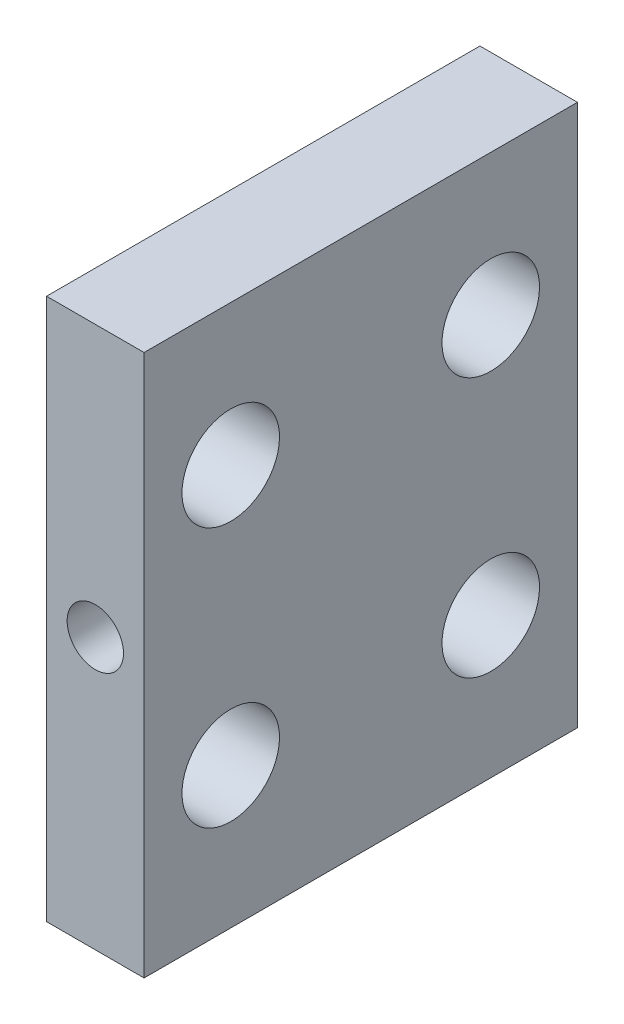
ISO-10303-21;
HEADER;
FILE_DESCRIPTION(('STEP AP214'),'2;1');
FILE_NAME('part.step','',(''),(''),'','','');
FILE_SCHEMA(('AUTOMOTIVE_DESIGN { 1 0 10303 214 1 1 1 1 }'));
ENDSEC;
DATA;
#1=APPLICATION_CONTEXT('core data for automotive mechanical design processes');
#2=APPLICATION_PROTOCOL_DEFINITION('international standard','automotive_design',2000,#1);
#3=PRODUCT_CONTEXT('',#1,'mechanical');
#4=PRODUCT('Part','Part','',(#3));
#5=PRODUCT_RELATED_PRODUCT_CATEGORY('part','',(#4));
#6=PRODUCT_DEFINITION_FORMATION('','',#4);
#7=PRODUCT_DEFINITION_CONTEXT('part definition',#1,'design');
#8=PRODUCT_DEFINITION('design','',#6,#7);
#9=PRODUCT_DEFINITION_SHAPE('','',#8);
#10=(LENGTH_UNIT() NAMED_UNIT(*) SI_UNIT(.MILLI.,.METRE.));
#11=(NAMED_UNIT(*) PLANE_ANGLE_UNIT() SI_UNIT($,.RADIAN.));
#12=(NAMED_UNIT(*) SI_UNIT($,.STERADIAN.) SOLID_ANGLE_UNIT());
#13=UNCERTAINTY_MEASURE_WITH_UNIT(LENGTH_MEASURE(1.E-05),#10,'distance_accuracy_value','');
#14=(GEOMETRIC_REPRESENTATION_CONTEXT(3) GLOBAL_UNCERTAINTY_ASSIGNED_CONTEXT((#13)) GLOBAL_UNIT_ASSIGNED_CONTEXT((#10,
#11,#12)) REPRESENTATION_CONTEXT('',''));
#15=CARTESIAN_POINT('',(0.,0.,0.));
#16=DIRECTION('',(0.,0.,1.));
#17=DIRECTION('',(1.,0.,0.));
#18=AXIS2_PLACEMENT_3D('',#15,#16,#17);
#19=CARTESIAN_POINT('',(0.,0.,20.));
#20=DIRECTION('',(1.,0.,0.));
#21=DIRECTION('',(0.,0.,-1.));
#22=AXIS2_PLACEMENT_3D('',#19,#20,#21);
#23=PLANE('',#22);
#24=DIRECTION('',(0.,-1.,0.));
#25=VECTOR('',#24,1.);
#26=CARTESIAN_POINT('',(0.,25.,0.));
#27=LINE('',#26,#25);
#28=CARTESIAN_POINT('',(0.,25.,0.));
#29=VERTEX_POINT('',#28);
#30=CARTESIAN_POINT('',(0.,0.,0.));
#31=VERTEX_POINT('',#30);
#32=EDGE_CURVE('E9',#29,#31,#27,.T.);
#33=ORIENTED_EDGE('',*,*,#32,.T.);
#34=DIRECTION('',(0.,0.,-1.));
#35=VECTOR('',#34,1.);
#36=CARTESIAN_POINT('',(0.,0.,20.));
#37=LINE('',#36,#35);
#38=CARTESIAN_POINT('',(0.,0.,20.));
#39=VERTEX_POINT('',#38);
#40=EDGE_CURVE('E34',#39,#31,#37,.T.);
#41=ORIENTED_EDGE('',*,*,#40,.F.);
#42=DIRECTION('',(0.,-1.,0.));
#43=VECTOR('',#42,1.);
#44=CARTESIAN_POINT('',(0.,25.,20.));
#45=LINE('',#44,#43);
#46=CARTESIAN_POINT('',(0.,25.,20.));
#47=VERTEX_POINT('',#46);
#48=EDGE_CURVE('E74',#47,#39,#45,.T.);
#49=ORIENTED_EDGE('',*,*,#48,.F.);
#50=DIRECTION('',(0.,0.,-1.));
#51=VECTOR('',#50,1.);
#52=CARTESIAN_POINT('',(0.,25.,20.));
#53=LINE('',#52,#51);
#54=EDGE_CURVE('E25',#47,#29,#53,.T.);
#55=ORIENTED_EDGE('',*,*,#54,.T.);
#56=EDGE_LOOP('',(#33,#41,#49,#55));
#57=FACE_BOUND('',#56,.T.);
#58=CARTESIAN_POINT('',(0.,18.5,4.));
#59=DIRECTION('',(1.,0.,0.));
#60=DIRECTION('',(0.,1.,0.));
#61=AXIS2_PLACEMENT_3D('',#58,#59,#60);
#62=CIRCLE('',#61,2.25);
#63=CARTESIAN_POINT('',(0.,20.75,4.));
#64=VERTEX_POINT('',#63);
#65=EDGE_CURVE('E136',#64,#64,#62,.T.);
#66=ORIENTED_EDGE('',*,*,#65,.T.);
#67=EDGE_LOOP('',(#66));
#68=FACE_BOUND('',#67,.T.);
#69=CARTESIAN_POINT('',(0.,6.5,4.));
#70=DIRECTION('',(1.,0.,0.));
#71=DIRECTION('',(0.,1.,0.));
#72=AXIS2_PLACEMENT_3D('',#69,#70,#71);
#73=CIRCLE('',#72,2.25);
#74=CARTESIAN_POINT('',(0.,8.75,4.));
#75=VERTEX_POINT('',#74);
#76=EDGE_CURVE('E124',#75,#75,#73,.T.);
#77=ORIENTED_EDGE('',*,*,#76,.T.);
#78=EDGE_LOOP('',(#77));
#79=FACE_BOUND('',#78,.T.);
#80=CARTESIAN_POINT('',(0.,6.5,16.));
#81=DIRECTION('',(1.,0.,0.));
#82=DIRECTION('',(0.,1.,0.));
#83=AXIS2_PLACEMENT_3D('',#80,#81,#82);
#84=CIRCLE('',#83,2.25);
#85=CARTESIAN_POINT('',(0.,8.75,16.));
#86=VERTEX_POINT('',#85);
#87=EDGE_CURVE('E120',#86,#86,#84,.T.);
#88=ORIENTED_EDGE('',*,*,#87,.T.);
#89=EDGE_LOOP('',(#88));
#90=FACE_BOUND('',#89,.T.);
#91=CARTESIAN_POINT('',(0.,18.5,16.));
#92=DIRECTION('',(1.,0.,0.));
#93=DIRECTION('',(0.,1.,0.));
#94=AXIS2_PLACEMENT_3D('',#91,#92,#93);
#95=CIRCLE('',#94,2.25);
#96=CARTESIAN_POINT('',(0.,20.75,16.));
#97=VERTEX_POINT('',#96);
#98=EDGE_CURVE('E118',#97,#97,#95,.T.);
#99=ORIENTED_EDGE('',*,*,#98,.T.);
#100=EDGE_LOOP('',(#99));
#101=FACE_BOUND('',#100,.T.);
#102=ADVANCED_FACE('F15',(#57,#68,#79,#90,#101),#23,.F.);
#103=CARTESIAN_POINT('',(0.,0.,20.));
#104=DIRECTION('',(0.,1.,0.));
#105=DIRECTION('',(0.,0.,1.));
#106=AXIS2_PLACEMENT_3D('',#103,#104,#105);
#107=PLANE('',#106);
#108=DIRECTION('',(1.,0.,0.));
#109=VECTOR('',#108,1.);
#110=CARTESIAN_POINT('',(0.,0.,0.));
#111=LINE('',#110,#109);
#112=CARTESIAN_POINT('',(4.5,0.,0.));
#113=VERTEX_POINT('',#112);
#114=EDGE_CURVE('E121',#31,#113,#111,.T.);
#115=ORIENTED_EDGE('',*,*,#114,.T.);
#116=DIRECTION('',(0.,0.,-1.));
#117=VECTOR('',#116,1.);
#118=CARTESIAN_POINT('',(4.5,0.,20.));
#119=LINE('',#118,#117);
#120=CARTESIAN_POINT('',(4.5,0.,20.));
#121=VERTEX_POINT('',#120);
#122=EDGE_CURVE('E129',#121,#113,#119,.T.);
#123=ORIENTED_EDGE('',*,*,#122,.F.);
#124=DIRECTION('',(1.,0.,0.));
#125=VECTOR('',#124,1.);
#126=CARTESIAN_POINT('',(0.,0.,20.));
#127=LINE('',#126,#125);
#128=EDGE_CURVE('E64',#39,#121,#127,.T.);
#129=ORIENTED_EDGE('',*,*,#128,.F.);
#130=ORIENTED_EDGE('',*,*,#40,.T.);
#131=EDGE_LOOP('',(#115,#123,#129,#130));
#132=FACE_BOUND('',#131,.T.);
#133=ADVANCED_FACE('F109',(#132),#107,.F.);
#134=CARTESIAN_POINT('',(4.5,0.,20.));
#135=DIRECTION('',(-1.,0.,0.));
#136=DIRECTION('',(0.,0.,1.));
#137=AXIS2_PLACEMENT_3D('',#134,#135,#136);
#138=PLANE('',#137);
#139=DIRECTION('',(0.,1.,0.));
#140=VECTOR('',#139,1.);
#141=CARTESIAN_POINT('',(4.5,0.,0.));
#142=LINE('',#141,#140);
#143=CARTESIAN_POINT('',(4.5,25.,0.));
#144=VERTEX_POINT('',#143);
#145=EDGE_CURVE('E71',#113,#144,#142,.T.);
#146=ORIENTED_EDGE('',*,*,#145,.T.);
#147=DIRECTION('',(0.,0.,-1.));
#148=VECTOR('',#147,1.);
#149=CARTESIAN_POINT('',(4.5,25.,20.));
#150=LINE('',#149,#148);
#151=CARTESIAN_POINT('',(4.5,25.,20.));
#152=VERTEX_POINT('',#151);
#153=EDGE_CURVE('E54',#152,#144,#150,.T.);
#154=ORIENTED_EDGE('',*,*,#153,.F.);
#155=DIRECTION('',(0.,1.,0.));
#156=VECTOR('',#155,1.);
#157=CARTESIAN_POINT('',(4.5,0.,20.));
#158=LINE('',#157,#156);
#159=EDGE_CURVE('E60',#121,#152,#158,.T.);
#160=ORIENTED_EDGE('',*,*,#159,.F.);
#161=ORIENTED_EDGE('',*,*,#122,.T.);
#162=EDGE_LOOP('',(#146,#154,#160,#161));
#163=FACE_BOUND('',#162,.T.);
#164=CARTESIAN_POINT('',(4.5,18.5,4.));
#165=DIRECTION('',(1.,0.,0.));
#166=DIRECTION('',(0.,1.,0.));
#167=AXIS2_PLACEMENT_3D('',#164,#165,#166);
#168=CIRCLE('',#167,2.25);
#169=CARTESIAN_POINT('',(4.5,20.75,4.));
#170=VERTEX_POINT('',#169);
#171=EDGE_CURVE('E90',#170,#170,#168,.T.);
#172=ORIENTED_EDGE('',*,*,#171,.F.);
#173=EDGE_LOOP('',(#172));
#174=FACE_BOUND('',#173,.T.);
#175=CARTESIAN_POINT('',(4.5,6.5,4.));
#176=DIRECTION('',(1.,0.,0.));
#177=DIRECTION('',(0.,1.,0.));
#178=AXIS2_PLACEMENT_3D('',#175,#176,#177);
#179=CIRCLE('',#178,2.25);
#180=CARTESIAN_POINT('',(4.5,8.75,4.));
#181=VERTEX_POINT('',#180);
#182=EDGE_CURVE('E94',#181,#181,#179,.T.);
#183=ORIENTED_EDGE('',*,*,#182,.F.);
#184=EDGE_LOOP('',(#183));
#185=FACE_BOUND('',#184,.T.);
#186=CARTESIAN_POINT('',(4.5,6.5,16.));
#187=DIRECTION('',(1.,0.,0.));
#188=DIRECTION('',(0.,1.,0.));
#189=AXIS2_PLACEMENT_3D('',#186,#187,#188);
#190=CIRCLE('',#189,2.25);
#191=CARTESIAN_POINT('',(4.5,8.75,16.));
#192=VERTEX_POINT('',#191);
#193=EDGE_CURVE('E82',#192,#192,#190,.T.);
#194=ORIENTED_EDGE('',*,*,#193,.F.);
#195=EDGE_LOOP('',(#194));
#196=FACE_BOUND('',#195,.T.);
#197=CARTESIAN_POINT('',(4.5,18.5,16.));
#198=DIRECTION('',(1.,0.,0.));
#199=DIRECTION('',(0.,1.,0.));
#200=AXIS2_PLACEMENT_3D('',#197,#198,#199);
#201=CIRCLE('',#200,2.25);
#202=CARTESIAN_POINT('',(4.5,20.75,16.));
#203=VERTEX_POINT('',#202);
#204=EDGE_CURVE('E79',#203,#203,#201,.T.);
#205=ORIENTED_EDGE('',*,*,#204,.F.);
#206=EDGE_LOOP('',(#205));
#207=FACE_BOUND('',#206,.T.);
#208=ADVANCED_FACE('F68',(#163,#174,#185,#196,#207),#138,.F.);
#209=CARTESIAN_POINT('',(0.,25.,20.));
#210=DIRECTION('',(0.,-1.,0.));
#211=DIRECTION('',(0.,0.,-1.));
#212=AXIS2_PLACEMENT_3D('',#209,#210,#211);
#213=PLANE('',#212);
#214=DIRECTION('',(-1.,0.,0.));
#215=VECTOR('',#214,1.);
#216=CARTESIAN_POINT('',(4.5,25.,0.));
#217=LINE('',#216,#215);
#218=EDGE_CURVE('E73',#144,#29,#217,.T.);
#219=ORIENTED_EDGE('',*,*,#218,.T.);
#220=ORIENTED_EDGE('',*,*,#54,.F.);
#221=DIRECTION('',(-1.,0.,0.));
#222=VECTOR('',#221,1.);
#223=CARTESIAN_POINT('',(4.5,25.,20.));
#224=LINE('',#223,#222);
#225=EDGE_CURVE('E63',#152,#47,#224,.T.);
#226=ORIENTED_EDGE('',*,*,#225,.F.);
#227=ORIENTED_EDGE('',*,*,#153,.T.);
#228=EDGE_LOOP('',(#219,#220,#226,#227));
#229=FACE_BOUND('',#228,.T.);
#230=ADVANCED_FACE('F77',(#229),#213,.F.);
#231=CARTESIAN_POINT('',(0.,0.,20.));
#232=DIRECTION('',(0.,0.,-1.));
#233=DIRECTION('',(-1.,0.,0.));
#234=AXIS2_PLACEMENT_3D('',#231,#232,#233);
#235=PLANE('',#234);
#236=ORIENTED_EDGE('',*,*,#48,.T.);
#237=ORIENTED_EDGE('',*,*,#128,.T.);
#238=ORIENTED_EDGE('',*,*,#159,.T.);
#239=ORIENTED_EDGE('',*,*,#225,.T.);
#240=EDGE_LOOP('',(#236,#237,#238,#239));
#241=FACE_BOUND('',#240,.T.);
#242=CARTESIAN_POINT('',(2.25,12.5,20.));
#243=DIRECTION('',(0.,0.,1.));
#244=DIRECTION('',(1.,0.,0.));
#245=AXIS2_PLACEMENT_3D('',#242,#243,#244);
#246=CIRCLE('',#245,1.3);
#247=CARTESIAN_POINT('',(3.55,12.5,20.));
#248=VERTEX_POINT('',#247);
#249=EDGE_CURVE('E85',#248,#248,#246,.T.);
#250=ORIENTED_EDGE('',*,*,#249,.F.);
#251=EDGE_LOOP('',(#250));
#252=FACE_BOUND('',#251,.T.);
#253=ADVANCED_FACE('F61',(#241,#252),#235,.F.);
#254=CARTESIAN_POINT('',(0.,0.,0.));
#255=DIRECTION('',(0.,0.,-1.));
#256=DIRECTION('',(-1.,0.,0.));
#257=AXIS2_PLACEMENT_3D('',#254,#255,#256);
#258=PLANE('',#257);
#259=ORIENTED_EDGE('',*,*,#32,.F.);
#260=ORIENTED_EDGE('',*,*,#218,.F.);
#261=ORIENTED_EDGE('',*,*,#145,.F.);
#262=ORIENTED_EDGE('',*,*,#114,.F.);
#263=EDGE_LOOP('',(#259,#260,#261,#262));
#264=FACE_BOUND('',#263,.T.);
#265=CARTESIAN_POINT('',(2.25,12.5,0.));
#266=DIRECTION('',(0.,0.,-1.));
#267=DIRECTION('',(0.,-1.,0.));
#268=AXIS2_PLACEMENT_3D('',#265,#266,#267);
#269=CIRCLE('',#268,1.3);
#270=CARTESIAN_POINT('',(2.25,11.2,0.));
#271=VERTEX_POINT('',#270);
#272=EDGE_CURVE('E19',#271,#271,#269,.T.);
#273=ORIENTED_EDGE('',*,*,#272,.F.);
#274=EDGE_LOOP('',(#273));
#275=FACE_BOUND('',#274,.T.);
#276=ADVANCED_FACE('F115',(#264,#275),#258,.T.);
#277=CARTESIAN_POINT('',(-36.5,18.5,16.));
#278=DIRECTION('',(1.,0.,0.));
#279=DIRECTION('',(0.,1.,0.));
#280=AXIS2_PLACEMENT_3D('',#277,#278,#279);
#281=CYLINDRICAL_SURFACE('',#280,2.25);
#282=ORIENTED_EDGE('',*,*,#204,.T.);
#283=EDGE_LOOP('',(#282));
#284=FACE_BOUND('',#283,.T.);
#285=ORIENTED_EDGE('',*,*,#98,.F.);
#286=EDGE_LOOP('',(#285));
#287=FACE_BOUND('',#286,.T.);
#288=ADVANCED_FACE('F17',(#284,#287),#281,.F.);
#289=CARTESIAN_POINT('',(-36.5,6.5,16.));
#290=DIRECTION('',(1.,0.,0.));
#291=DIRECTION('',(0.,1.,0.));
#292=AXIS2_PLACEMENT_3D('',#289,#290,#291);
#293=CYLINDRICAL_SURFACE('',#292,2.25);
#294=ORIENTED_EDGE('',*,*,#193,.T.);
#295=EDGE_LOOP('',(#294));
#296=FACE_BOUND('',#295,.T.);
#297=ORIENTED_EDGE('',*,*,#87,.F.);
#298=EDGE_LOOP('',(#297));
#299=FACE_BOUND('',#298,.T.);
#300=ADVANCED_FACE('F104',(#296,#299),#293,.F.);
#301=CARTESIAN_POINT('',(-36.5,6.5,4.));
#302=DIRECTION('',(1.,0.,0.));
#303=DIRECTION('',(0.,1.,0.));
#304=AXIS2_PLACEMENT_3D('',#301,#302,#303);
#305=CYLINDRICAL_SURFACE('',#304,2.25);
#306=ORIENTED_EDGE('',*,*,#182,.T.);
#307=EDGE_LOOP('',(#306));
#308=FACE_BOUND('',#307,.T.);
#309=ORIENTED_EDGE('',*,*,#76,.F.);
#310=EDGE_LOOP('',(#309));
#311=FACE_BOUND('',#310,.T.);
#312=ADVANCED_FACE('F143',(#308,#311),#305,.F.);
#313=CARTESIAN_POINT('',(-36.5,18.5,4.));
#314=DIRECTION('',(1.,0.,0.));
#315=DIRECTION('',(0.,1.,0.));
#316=AXIS2_PLACEMENT_3D('',#313,#314,#315);
#317=CYLINDRICAL_SURFACE('',#316,2.25);
#318=ORIENTED_EDGE('',*,*,#171,.T.);
#319=EDGE_LOOP('',(#318));
#320=FACE_BOUND('',#319,.T.);
#321=ORIENTED_EDGE('',*,*,#65,.F.);
#322=EDGE_LOOP('',(#321));
#323=FACE_BOUND('',#322,.T.);
#324=ADVANCED_FACE('F145',(#320,#323),#317,.F.);
#325=CARTESIAN_POINT('',(2.25,12.5,-10.));
#326=DIRECTION('',(0.,0.,1.));
#327=DIRECTION('',(1.,0.,0.));
#328=AXIS2_PLACEMENT_3D('',#325,#326,#327);
#329=CYLINDRICAL_SURFACE('',#328,1.3);
#330=ORIENTED_EDGE('',*,*,#272,.T.);
#331=EDGE_LOOP('',(#330));
#332=FACE_BOUND('',#331,.T.);
#333=ORIENTED_EDGE('',*,*,#249,.T.);
#334=EDGE_LOOP('',(#333));
#335=FACE_BOUND('',#334,.T.);
#336=ADVANCED_FACE('F153',(#332,#335),#329,.F.);
#337=CLOSED_SHELL('',(#102,#133,#208,#230,#253,#276,#288,#300,#312,#324,#336));
#338=MANIFOLD_SOLID_BREP('B1',#337);
#339=ADVANCED_BREP_SHAPE_REPRESENTATION('',(#18,#338),#14);
#340=SHAPE_DEFINITION_REPRESENTATION(#9,#339);
ENDSEC;
END-ISO-10303-21;
